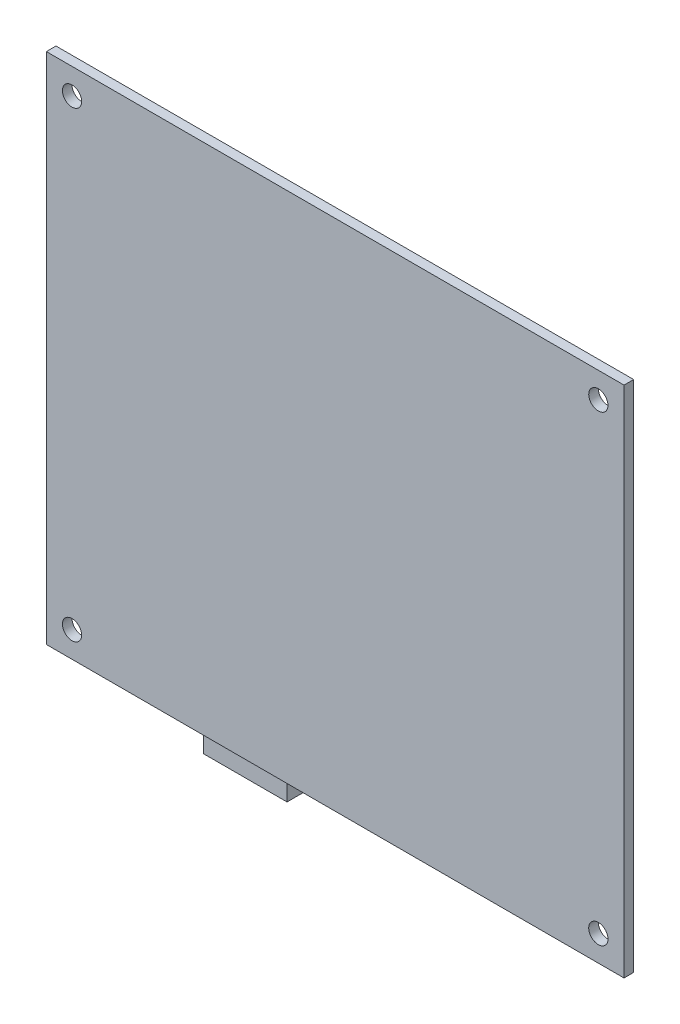
ISO-10303-21;
HEADER;
FILE_DESCRIPTION(('STEP AP214'),'2;1');
FILE_NAME('part.step','',(''),(''),'','','');
FILE_SCHEMA(('AUTOMOTIVE_DESIGN { 1 0 10303 214 1 1 1 1 }'));
ENDSEC;
DATA;
#1=APPLICATION_CONTEXT('core data for automotive mechanical design processes');
#2=APPLICATION_PROTOCOL_DEFINITION('international standard','automotive_design',2000,#1);
#3=PRODUCT_CONTEXT('',#1,'mechanical');
#4=PRODUCT('Part','Part','',(#3));
#5=PRODUCT_RELATED_PRODUCT_CATEGORY('part','',(#4));
#6=PRODUCT_DEFINITION_FORMATION('','',#4);
#7=PRODUCT_DEFINITION_CONTEXT('part definition',#1,'design');
#8=PRODUCT_DEFINITION('design','',#6,#7);
#9=PRODUCT_DEFINITION_SHAPE('','',#8);
#10=(LENGTH_UNIT() NAMED_UNIT(*) SI_UNIT(.MILLI.,.METRE.));
#11=(NAMED_UNIT(*) PLANE_ANGLE_UNIT() SI_UNIT($,.RADIAN.));
#12=(NAMED_UNIT(*) SI_UNIT($,.STERADIAN.) SOLID_ANGLE_UNIT());
#13=UNCERTAINTY_MEASURE_WITH_UNIT(LENGTH_MEASURE(1.E-05),#10,'distance_accuracy_value','');
#14=(GEOMETRIC_REPRESENTATION_CONTEXT(3) GLOBAL_UNCERTAINTY_ASSIGNED_CONTEXT((#13)) GLOBAL_UNIT_ASSIGNED_CONTEXT((#10,
#11,#12)) REPRESENTATION_CONTEXT('',''));
#15=CARTESIAN_POINT('',(0.,0.,0.));
#16=DIRECTION('',(0.,0.,1.));
#17=DIRECTION('',(1.,0.,0.));
#18=AXIS2_PLACEMENT_3D('',#15,#16,#17);
#19=CARTESIAN_POINT('',(0.,0.,0.));
#20=DIRECTION('',(0.,0.,-1.));
#21=DIRECTION('',(-1.,0.,0.));
#22=AXIS2_PLACEMENT_3D('',#19,#20,#21);
#23=PLANE('',#22);
#24=CARTESIAN_POINT('',(85.9999999999999,4.,0.));
#25=DIRECTION('',(0.,0.,1.));
#26=DIRECTION('',(1.,0.,0.));
#27=AXIS2_PLACEMENT_3D('',#24,#25,#26);
#28=CIRCLE('',#27,1.5);
#29=CARTESIAN_POINT('',(87.4999999999999,4.,0.));
#30=VERTEX_POINT('',#29);
#31=EDGE_CURVE('E345',#30,#30,#28,.T.);
#32=ORIENTED_EDGE('',*,*,#31,.T.);
#33=EDGE_LOOP('',(#32));
#34=FACE_BOUND('',#33,.T.);
#35=CARTESIAN_POINT('',(4.,76.,0.));
#36=DIRECTION('',(0.,0.,1.));
#37=DIRECTION('',(1.,0.,0.));
#38=AXIS2_PLACEMENT_3D('',#35,#36,#37);
#39=CIRCLE('',#38,1.5);
#40=CARTESIAN_POINT('',(5.5,76.,0.));
#41=VERTEX_POINT('',#40);
#42=EDGE_CURVE('E361',#41,#41,#39,.T.);
#43=ORIENTED_EDGE('',*,*,#42,.T.);
#44=EDGE_LOOP('',(#43));
#45=FACE_BOUND('',#44,.T.);
#46=CARTESIAN_POINT('',(86.,76.,0.));
#47=DIRECTION('',(0.,0.,1.));
#48=DIRECTION('',(-1.,0.,0.));
#49=AXIS2_PLACEMENT_3D('',#46,#47,#48);
#50=CIRCLE('',#49,1.5);
#51=CARTESIAN_POINT('',(84.5,76.,0.));
#52=VERTEX_POINT('',#51);
#53=EDGE_CURVE('E353',#52,#52,#50,.T.);
#54=ORIENTED_EDGE('',*,*,#53,.T.);
#55=EDGE_LOOP('',(#54));
#56=FACE_BOUND('',#55,.T.);
#57=CARTESIAN_POINT('',(4.,4.,0.));
#58=DIRECTION('',(0.,0.,1.));
#59=DIRECTION('',(-1.,0.,0.));
#60=AXIS2_PLACEMENT_3D('',#57,#58,#59);
#61=CIRCLE('',#60,1.5);
#62=CARTESIAN_POINT('',(2.5,4.,0.));
#63=VERTEX_POINT('',#62);
#64=EDGE_CURVE('E340',#63,#63,#61,.T.);
#65=ORIENTED_EDGE('',*,*,#64,.T.);
#66=EDGE_LOOP('',(#65));
#67=FACE_BOUND('',#66,.T.);
#68=DIRECTION('',(1.,0.,0.));
#69=VECTOR('',#68,1.);
#70=CARTESIAN_POINT('',(10.,15.,0.));
#71=LINE('',#70,#69);
#72=CARTESIAN_POINT('',(10.,15.,0.));
#73=VERTEX_POINT('',#72);
#74=CARTESIAN_POINT('',(20.,15.,0.));
#75=VERTEX_POINT('',#74);
#76=EDGE_CURVE('E284',#73,#75,#71,.T.);
#77=ORIENTED_EDGE('',*,*,#76,.F.);
#78=DIRECTION('',(0.,-1.,0.));
#79=VECTOR('',#78,1.);
#80=CARTESIAN_POINT('',(10.,15.,0.));
#81=LINE('',#80,#79);
#82=CARTESIAN_POINT('',(10.,0.,0.));
#83=VERTEX_POINT('',#82);
#84=EDGE_CURVE('E242',#73,#83,#81,.T.);
#85=ORIENTED_EDGE('',*,*,#84,.T.);
#86=DIRECTION('',(1.,0.,0.));
#87=VECTOR('',#86,1.);
#88=CARTESIAN_POINT('',(0.,0.,0.));
#89=LINE('',#88,#87);
#90=CARTESIAN_POINT('',(0.,0.,0.));
#91=VERTEX_POINT('',#90);
#92=EDGE_CURVE('E392',#91,#83,#89,.T.);
#93=ORIENTED_EDGE('',*,*,#92,.F.);
#94=DIRECTION('',(0.,-1.,0.));
#95=VECTOR('',#94,1.);
#96=CARTESIAN_POINT('',(0.,0.,0.));
#97=LINE('',#96,#95);
#98=CARTESIAN_POINT('',(0.,80.,0.));
#99=VERTEX_POINT('',#98);
#100=EDGE_CURVE('E369',#99,#91,#97,.T.);
#101=ORIENTED_EDGE('',*,*,#100,.F.);
#102=DIRECTION('',(-1.,0.,0.));
#103=VECTOR('',#102,1.);
#104=CARTESIAN_POINT('',(0.,80.,0.));
#105=LINE('',#104,#103);
#106=CARTESIAN_POINT('',(90.,80.,0.));
#107=VERTEX_POINT('',#106);
#108=EDGE_CURVE('E378',#107,#99,#105,.T.);
#109=ORIENTED_EDGE('',*,*,#108,.F.);
#110=DIRECTION('',(0.,1.,0.));
#111=VECTOR('',#110,1.);
#112=CARTESIAN_POINT('',(90.,0.,0.));
#113=LINE('',#112,#111);
#114=CARTESIAN_POINT('',(90.,0.,0.));
#115=VERTEX_POINT('',#114);
#116=EDGE_CURVE('E396',#115,#107,#113,.T.);
#117=ORIENTED_EDGE('',*,*,#116,.F.);
#118=CARTESIAN_POINT('',(36.,0.,0.));
#119=VERTEX_POINT('',#118);
#120=EDGE_CURVE('E391',#119,#115,#89,.T.);
#121=ORIENTED_EDGE('',*,*,#120,.F.);
#122=DIRECTION('',(0.,-1.,0.));
#123=VECTOR('',#122,1.);
#124=CARTESIAN_POINT('',(36.,15.,0.));
#125=LINE('',#124,#123);
#126=CARTESIAN_POINT('',(36.,15.,0.));
#127=VERTEX_POINT('',#126);
#128=EDGE_CURVE('E332',#127,#119,#125,.T.);
#129=ORIENTED_EDGE('',*,*,#128,.F.);
#130=DIRECTION('',(1.,0.,0.));
#131=VECTOR('',#130,1.);
#132=CARTESIAN_POINT('',(23.,15.,0.));
#133=LINE('',#132,#131);
#134=CARTESIAN_POINT('',(23.,15.,0.));
#135=VERTEX_POINT('',#134);
#136=EDGE_CURVE('E317',#135,#127,#133,.T.);
#137=ORIENTED_EDGE('',*,*,#136,.F.);
#138=DIRECTION('',(0.,-1.,0.));
#139=VECTOR('',#138,1.);
#140=CARTESIAN_POINT('',(23.,15.,0.));
#141=LINE('',#140,#139);
#142=CARTESIAN_POINT('',(23.,0.,0.));
#143=VERTEX_POINT('',#142);
#144=EDGE_CURVE('E336',#135,#143,#141,.T.);
#145=ORIENTED_EDGE('',*,*,#144,.T.);
#146=CARTESIAN_POINT('',(20.,0.,0.));
#147=VERTEX_POINT('',#146);
#148=EDGE_CURVE('E397',#147,#143,#89,.T.);
#149=ORIENTED_EDGE('',*,*,#148,.F.);
#150=DIRECTION('',(0.,-1.,0.));
#151=VECTOR('',#150,1.);
#152=CARTESIAN_POINT('',(20.,15.,0.));
#153=LINE('',#152,#151);
#154=EDGE_CURVE('E257',#75,#147,#153,.T.);
#155=ORIENTED_EDGE('',*,*,#154,.F.);
#156=EDGE_LOOP('',(#77,#85,#93,#101,#109,#117,#121,#129,#137,#145,#149,#155));
#157=FACE_BOUND('',#156,.T.);
#158=ADVANCED_FACE('F45',(#34,#45,#56,#67,#157),#23,.T.);
#159=CARTESIAN_POINT('',(0.,0.,1.5));
#160=DIRECTION('',(0.,1.,0.));
#161=DIRECTION('',(0.,0.,1.));
#162=AXIS2_PLACEMENT_3D('',#159,#160,#161);
#163=PLANE('',#162);
#164=DIRECTION('',(-1.,0.,0.));
#165=VECTOR('',#164,1.);
#166=CARTESIAN_POINT('',(23.,0.,0.));
#167=LINE('',#166,#165);
#168=EDGE_CURVE('E278',#119,#143,#167,.T.);
#169=ORIENTED_EDGE('',*,*,#168,.F.);
#170=ORIENTED_EDGE('',*,*,#120,.T.);
#171=DIRECTION('',(0.,0.,-1.));
#172=VECTOR('',#171,1.);
#173=CARTESIAN_POINT('',(90.,0.,1.5));
#174=LINE('',#173,#172);
#175=CARTESIAN_POINT('',(90.,0.,1.5));
#176=VERTEX_POINT('',#175);
#177=EDGE_CURVE('E54',#176,#115,#174,.T.);
#178=ORIENTED_EDGE('',*,*,#177,.F.);
#179=DIRECTION('',(1.,0.,0.));
#180=VECTOR('',#179,1.);
#181=CARTESIAN_POINT('',(0.,0.,1.5));
#182=LINE('',#181,#180);
#183=CARTESIAN_POINT('',(0.,0.,1.5));
#184=VERTEX_POINT('',#183);
#185=EDGE_CURVE('E377',#184,#176,#182,.T.);
#186=ORIENTED_EDGE('',*,*,#185,.F.);
#187=DIRECTION('',(0.,0.,-1.));
#188=VECTOR('',#187,1.);
#189=CARTESIAN_POINT('',(0.,0.,1.5));
#190=LINE('',#189,#188);
#191=EDGE_CURVE('E11',#184,#91,#190,.T.);
#192=ORIENTED_EDGE('',*,*,#191,.T.);
#193=ORIENTED_EDGE('',*,*,#92,.T.);
#194=DIRECTION('',(0.,0.,1.));
#195=VECTOR('',#194,1.);
#196=CARTESIAN_POINT('',(10.,0.,0.));
#197=LINE('',#196,#195);
#198=CARTESIAN_POINT('',(10.,0.,-12.));
#199=VERTEX_POINT('',#198);
#200=EDGE_CURVE('E275',#199,#83,#197,.T.);
#201=ORIENTED_EDGE('',*,*,#200,.F.);
#202=DIRECTION('',(-1.,0.,0.));
#203=VECTOR('',#202,1.);
#204=CARTESIAN_POINT('',(10.,0.,-12.));
#205=LINE('',#204,#203);
#206=CARTESIAN_POINT('',(20.,0.,-12.));
#207=VERTEX_POINT('',#206);
#208=EDGE_CURVE('E269',#207,#199,#205,.T.);
#209=ORIENTED_EDGE('',*,*,#208,.F.);
#210=DIRECTION('',(0.,0.,-1.));
#211=VECTOR('',#210,1.);
#212=CARTESIAN_POINT('',(20.,0.,0.));
#213=LINE('',#212,#211);
#214=EDGE_CURVE('E69',#147,#207,#213,.T.);
#215=ORIENTED_EDGE('',*,*,#214,.F.);
#216=ORIENTED_EDGE('',*,*,#148,.T.);
#217=EDGE_LOOP('',(#169,#170,#178,#186,#192,#193,#201,#209,#215,#216));
#218=FACE_BOUND('',#217,.T.);
#219=ADVANCED_FACE('F432',(#218),#163,.F.);
#220=CARTESIAN_POINT('',(0.,0.,1.5));
#221=DIRECTION('',(0.,0.,-1.));
#222=DIRECTION('',(-1.,0.,0.));
#223=AXIS2_PLACEMENT_3D('',#220,#221,#222);
#224=PLANE('',#223);
#225=DIRECTION('',(0.,-1.,0.));
#226=VECTOR('',#225,1.);
#227=CARTESIAN_POINT('',(0.,0.,1.5));
#228=LINE('',#227,#226);
#229=CARTESIAN_POINT('',(0.,80.,1.5));
#230=VERTEX_POINT('',#229);
#231=EDGE_CURVE('E373',#230,#184,#228,.T.);
#232=ORIENTED_EDGE('',*,*,#231,.T.);
#233=ORIENTED_EDGE('',*,*,#185,.T.);
#234=DIRECTION('',(0.,1.,0.));
#235=VECTOR('',#234,1.);
#236=CARTESIAN_POINT('',(90.,0.,1.5));
#237=LINE('',#236,#235);
#238=CARTESIAN_POINT('',(90.,80.,1.5));
#239=VERTEX_POINT('',#238);
#240=EDGE_CURVE('E381',#176,#239,#237,.T.);
#241=ORIENTED_EDGE('',*,*,#240,.T.);
#242=DIRECTION('',(-1.,0.,0.));
#243=VECTOR('',#242,1.);
#244=CARTESIAN_POINT('',(0.,80.,1.5));
#245=LINE('',#244,#243);
#246=EDGE_CURVE('E384',#239,#230,#245,.T.);
#247=ORIENTED_EDGE('',*,*,#246,.T.);
#248=EDGE_LOOP('',(#232,#233,#241,#247));
#249=FACE_BOUND('',#248,.T.);
#250=CARTESIAN_POINT('',(4.,76.,1.5));
#251=DIRECTION('',(0.,0.,1.));
#252=DIRECTION('',(1.,0.,0.));
#253=AXIS2_PLACEMENT_3D('',#250,#251,#252);
#254=CIRCLE('',#253,1.5);
#255=CARTESIAN_POINT('',(5.5,76.,1.5));
#256=VERTEX_POINT('',#255);
#257=EDGE_CURVE('E365',#256,#256,#254,.T.);
#258=ORIENTED_EDGE('',*,*,#257,.F.);
#259=EDGE_LOOP('',(#258));
#260=FACE_BOUND('',#259,.T.);
#261=CARTESIAN_POINT('',(86.,76.,1.5));
#262=DIRECTION('',(0.,0.,1.));
#263=DIRECTION('',(-1.,0.,0.));
#264=AXIS2_PLACEMENT_3D('',#261,#262,#263);
#265=CIRCLE('',#264,1.5);
#266=CARTESIAN_POINT('',(84.5,76.,1.5));
#267=VERTEX_POINT('',#266);
#268=EDGE_CURVE('E357',#267,#267,#265,.T.);
#269=ORIENTED_EDGE('',*,*,#268,.F.);
#270=EDGE_LOOP('',(#269));
#271=FACE_BOUND('',#270,.T.);
#272=CARTESIAN_POINT('',(85.9999999999999,4.,1.5));
#273=DIRECTION('',(0.,0.,1.));
#274=DIRECTION('',(1.,0.,0.));
#275=AXIS2_PLACEMENT_3D('',#272,#273,#274);
#276=CIRCLE('',#275,1.5);
#277=CARTESIAN_POINT('',(87.4999999999999,4.,1.5));
#278=VERTEX_POINT('',#277);
#279=EDGE_CURVE('E349',#278,#278,#276,.T.);
#280=ORIENTED_EDGE('',*,*,#279,.F.);
#281=EDGE_LOOP('',(#280));
#282=FACE_BOUND('',#281,.T.);
#283=CARTESIAN_POINT('',(4.,4.,1.5));
#284=DIRECTION('',(0.,0.,1.));
#285=DIRECTION('',(-1.,0.,0.));
#286=AXIS2_PLACEMENT_3D('',#283,#284,#285);
#287=CIRCLE('',#286,1.5);
#288=CARTESIAN_POINT('',(2.5,4.,1.5));
#289=VERTEX_POINT('',#288);
#290=EDGE_CURVE('E341',#289,#289,#287,.T.);
#291=ORIENTED_EDGE('',*,*,#290,.F.);
#292=EDGE_LOOP('',(#291));
#293=FACE_BOUND('',#292,.T.);
#294=ADVANCED_FACE('F430',(#249,#260,#271,#282,#293),#224,.F.);
#295=CARTESIAN_POINT('',(0.,0.,1.5));
#296=DIRECTION('',(1.,0.,0.));
#297=DIRECTION('',(0.,0.,-1.));
#298=AXIS2_PLACEMENT_3D('',#295,#296,#297);
#299=PLANE('',#298);
#300=ORIENTED_EDGE('',*,*,#100,.T.);
#301=ORIENTED_EDGE('',*,*,#191,.F.);
#302=ORIENTED_EDGE('',*,*,#231,.F.);
#303=DIRECTION('',(0.,0.,-1.));
#304=VECTOR('',#303,1.);
#305=CARTESIAN_POINT('',(0.,80.,1.5));
#306=LINE('',#305,#304);
#307=EDGE_CURVE('E387',#230,#99,#306,.T.);
#308=ORIENTED_EDGE('',*,*,#307,.T.);
#309=EDGE_LOOP('',(#300,#301,#302,#308));
#310=FACE_BOUND('',#309,.T.);
#311=ADVANCED_FACE('F47',(#310),#299,.F.);
#312=CARTESIAN_POINT('',(90.,0.,1.5));
#313=DIRECTION('',(-1.,0.,0.));
#314=DIRECTION('',(0.,0.,1.));
#315=AXIS2_PLACEMENT_3D('',#312,#313,#314);
#316=PLANE('',#315);
#317=ORIENTED_EDGE('',*,*,#116,.T.);
#318=DIRECTION('',(0.,0.,-1.));
#319=VECTOR('',#318,1.);
#320=CARTESIAN_POINT('',(90.,80.,1.5));
#321=LINE('',#320,#319);
#322=EDGE_CURVE('E405',#239,#107,#321,.T.);
#323=ORIENTED_EDGE('',*,*,#322,.F.);
#324=ORIENTED_EDGE('',*,*,#240,.F.);
#325=ORIENTED_EDGE('',*,*,#177,.T.);
#326=EDGE_LOOP('',(#317,#323,#324,#325));
#327=FACE_BOUND('',#326,.T.);
#328=ADVANCED_FACE('F414',(#327),#316,.F.);
#329=CARTESIAN_POINT('',(0.,80.,1.5));
#330=DIRECTION('',(0.,-1.,0.));
#331=DIRECTION('',(0.,0.,-1.));
#332=AXIS2_PLACEMENT_3D('',#329,#330,#331);
#333=PLANE('',#332);
#334=ORIENTED_EDGE('',*,*,#108,.T.);
#335=ORIENTED_EDGE('',*,*,#307,.F.);
#336=ORIENTED_EDGE('',*,*,#246,.F.);
#337=ORIENTED_EDGE('',*,*,#322,.T.);
#338=EDGE_LOOP('',(#334,#335,#336,#337));
#339=FACE_BOUND('',#338,.T.);
#340=ADVANCED_FACE('F424',(#339),#333,.F.);
#341=CARTESIAN_POINT('',(4.,76.,1.5));
#342=DIRECTION('',(0.,0.,-1.));
#343=DIRECTION('',(-1.,0.,0.));
#344=AXIS2_PLACEMENT_3D('',#341,#342,#343);
#345=CYLINDRICAL_SURFACE('',#344,1.5);
#346=ORIENTED_EDGE('',*,*,#257,.T.);
#347=EDGE_LOOP('',(#346));
#348=FACE_BOUND('',#347,.T.);
#349=ORIENTED_EDGE('',*,*,#42,.F.);
#350=EDGE_LOOP('',(#349));
#351=FACE_BOUND('',#350,.T.);
#352=ADVANCED_FACE('F496',(#348,#351),#345,.F.);
#353=CARTESIAN_POINT('',(86.,76.,1.5));
#354=DIRECTION('',(0.,0.,-1.));
#355=DIRECTION('',(-1.,0.,0.));
#356=AXIS2_PLACEMENT_3D('',#353,#354,#355);
#357=CYLINDRICAL_SURFACE('',#356,1.5);
#358=ORIENTED_EDGE('',*,*,#268,.T.);
#359=EDGE_LOOP('',(#358));
#360=FACE_BOUND('',#359,.T.);
#361=ORIENTED_EDGE('',*,*,#53,.F.);
#362=EDGE_LOOP('',(#361));
#363=FACE_BOUND('',#362,.T.);
#364=ADVANCED_FACE('F530',(#360,#363),#357,.F.);
#365=CARTESIAN_POINT('',(85.9999999999999,4.,1.5));
#366=DIRECTION('',(0.,0.,-1.));
#367=DIRECTION('',(-1.,0.,0.));
#368=AXIS2_PLACEMENT_3D('',#365,#366,#367);
#369=CYLINDRICAL_SURFACE('',#368,1.5);
#370=ORIENTED_EDGE('',*,*,#279,.T.);
#371=EDGE_LOOP('',(#370));
#372=FACE_BOUND('',#371,.T.);
#373=ORIENTED_EDGE('',*,*,#31,.F.);
#374=EDGE_LOOP('',(#373));
#375=FACE_BOUND('',#374,.T.);
#376=ADVANCED_FACE('F539',(#372,#375),#369,.F.);
#377=CARTESIAN_POINT('',(4.,4.,1.5));
#378=DIRECTION('',(0.,0.,-1.));
#379=DIRECTION('',(-1.,0.,0.));
#380=AXIS2_PLACEMENT_3D('',#377,#378,#379);
#381=CYLINDRICAL_SURFACE('',#380,1.5);
#382=ORIENTED_EDGE('',*,*,#290,.T.);
#383=EDGE_LOOP('',(#382));
#384=FACE_BOUND('',#383,.T.);
#385=ORIENTED_EDGE('',*,*,#64,.F.);
#386=EDGE_LOOP('',(#385));
#387=FACE_BOUND('',#386,.T.);
#388=ADVANCED_FACE('F549',(#384,#387),#381,.F.);
#389=CARTESIAN_POINT('',(23.,15.,-8.));
#390=DIRECTION('',(1.,0.,0.));
#391=DIRECTION('',(0.,0.,-1.));
#392=AXIS2_PLACEMENT_3D('',#389,#390,#391);
#393=PLANE('',#392);
#394=DIRECTION('',(0.,-1.,0.));
#395=VECTOR('',#394,1.);
#396=CARTESIAN_POINT('',(23.,15.,-8.));
#397=LINE('',#396,#395);
#398=CARTESIAN_POINT('',(23.,15.,-8.));
#399=VERTEX_POINT('',#398);
#400=CARTESIAN_POINT('',(23.,-4.,-8.));
#401=VERTEX_POINT('',#400);
#402=EDGE_CURVE('E326',#399,#401,#397,.T.);
#403=ORIENTED_EDGE('',*,*,#402,.T.);
#404=DIRECTION('',(0.,0.,-1.));
#405=VECTOR('',#404,1.);
#406=CARTESIAN_POINT('',(23.,-4.,0.));
#407=LINE('',#406,#405);
#408=CARTESIAN_POINT('',(23.,-4.,0.));
#409=VERTEX_POINT('',#408);
#410=EDGE_CURVE('E289',#409,#401,#407,.T.);
#411=ORIENTED_EDGE('',*,*,#410,.F.);
#412=DIRECTION('',(0.,1.,0.));
#413=VECTOR('',#412,1.);
#414=CARTESIAN_POINT('',(23.,-4.,0.));
#415=LINE('',#414,#413);
#416=EDGE_CURVE('E303',#409,#143,#415,.T.);
#417=ORIENTED_EDGE('',*,*,#416,.T.);
#418=ORIENTED_EDGE('',*,*,#144,.F.);
#419=DIRECTION('',(0.,0.,1.));
#420=VECTOR('',#419,1.);
#421=CARTESIAN_POINT('',(23.,15.,-8.));
#422=LINE('',#421,#420);
#423=EDGE_CURVE('E314',#399,#135,#422,.T.);
#424=ORIENTED_EDGE('',*,*,#423,.F.);
#425=EDGE_LOOP('',(#403,#411,#417,#418,#424));
#426=FACE_BOUND('',#425,.T.);
#427=ADVANCED_FACE('F467',(#426),#393,.F.);
#428=CARTESIAN_POINT('',(36.,15.,-8.));
#429=DIRECTION('',(-1.,0.,0.));
#430=DIRECTION('',(0.,0.,1.));
#431=AXIS2_PLACEMENT_3D('',#428,#429,#430);
#432=PLANE('',#431);
#433=ORIENTED_EDGE('',*,*,#128,.T.);
#434=DIRECTION('',(0.,1.,0.));
#435=VECTOR('',#434,1.);
#436=CARTESIAN_POINT('',(36.,-4.,0.));
#437=LINE('',#436,#435);
#438=CARTESIAN_POINT('',(36.,-4.,0.));
#439=VERTEX_POINT('',#438);
#440=EDGE_CURVE('E310',#439,#119,#437,.T.);
#441=ORIENTED_EDGE('',*,*,#440,.F.);
#442=DIRECTION('',(0.,0.,1.));
#443=VECTOR('',#442,1.);
#444=CARTESIAN_POINT('',(36.,-4.,0.));
#445=LINE('',#444,#443);
#446=CARTESIAN_POINT('',(36.,-4.,-8.));
#447=VERTEX_POINT('',#446);
#448=EDGE_CURVE('E297',#447,#439,#445,.T.);
#449=ORIENTED_EDGE('',*,*,#448,.F.);
#450=DIRECTION('',(0.,-1.,0.));
#451=VECTOR('',#450,1.);
#452=CARTESIAN_POINT('',(36.,15.,-8.));
#453=LINE('',#452,#451);
#454=CARTESIAN_POINT('',(36.,15.,-8.));
#455=VERTEX_POINT('',#454);
#456=EDGE_CURVE('E329',#455,#447,#453,.T.);
#457=ORIENTED_EDGE('',*,*,#456,.F.);
#458=DIRECTION('',(0.,0.,-1.));
#459=VECTOR('',#458,1.);
#460=CARTESIAN_POINT('',(36.,15.,-8.));
#461=LINE('',#460,#459);
#462=EDGE_CURVE('E320',#127,#455,#461,.T.);
#463=ORIENTED_EDGE('',*,*,#462,.F.);
#464=EDGE_LOOP('',(#433,#441,#449,#457,#463));
#465=FACE_BOUND('',#464,.T.);
#466=ADVANCED_FACE('F457',(#465),#432,.F.);
#467=CARTESIAN_POINT('',(23.,15.,-8.));
#468=DIRECTION('',(0.,0.,1.));
#469=DIRECTION('',(1.,0.,0.));
#470=AXIS2_PLACEMENT_3D('',#467,#468,#469);
#471=PLANE('',#470);
#472=ORIENTED_EDGE('',*,*,#456,.T.);
#473=DIRECTION('',(1.,0.,0.));
#474=VECTOR('',#473,1.);
#475=CARTESIAN_POINT('',(23.,-4.,-8.));
#476=LINE('',#475,#474);
#477=EDGE_CURVE('E293',#401,#447,#476,.T.);
#478=ORIENTED_EDGE('',*,*,#477,.F.);
#479=ORIENTED_EDGE('',*,*,#402,.F.);
#480=DIRECTION('',(-1.,0.,0.));
#481=VECTOR('',#480,1.);
#482=CARTESIAN_POINT('',(23.,15.,-8.));
#483=LINE('',#482,#481);
#484=EDGE_CURVE('E323',#455,#399,#483,.T.);
#485=ORIENTED_EDGE('',*,*,#484,.F.);
#486=EDGE_LOOP('',(#472,#478,#479,#485));
#487=FACE_BOUND('',#486,.T.);
#488=ADVANCED_FACE('F474',(#487),#471,.F.);
#489=CARTESIAN_POINT('',(0.,15.,0.));
#490=DIRECTION('',(0.,1.,0.));
#491=DIRECTION('',(0.,0.,1.));
#492=AXIS2_PLACEMENT_3D('',#489,#490,#491);
#493=PLANE('',#492);
#494=ORIENTED_EDGE('',*,*,#423,.T.);
#495=ORIENTED_EDGE('',*,*,#136,.T.);
#496=ORIENTED_EDGE('',*,*,#462,.T.);
#497=ORIENTED_EDGE('',*,*,#484,.T.);
#498=EDGE_LOOP('',(#494,#495,#496,#497));
#499=FACE_BOUND('',#498,.T.);
#500=ADVANCED_FACE('F462',(#499),#493,.T.);
#501=CARTESIAN_POINT('',(23.,-4.,0.));
#502=DIRECTION('',(0.,0.,-1.));
#503=DIRECTION('',(-1.,0.,0.));
#504=AXIS2_PLACEMENT_3D('',#501,#502,#503);
#505=PLANE('',#504);
#506=ORIENTED_EDGE('',*,*,#168,.T.);
#507=ORIENTED_EDGE('',*,*,#416,.F.);
#508=DIRECTION('',(-1.,0.,0.));
#509=VECTOR('',#508,1.);
#510=CARTESIAN_POINT('',(23.,-4.,0.));
#511=LINE('',#510,#509);
#512=EDGE_CURVE('E300',#439,#409,#511,.T.);
#513=ORIENTED_EDGE('',*,*,#512,.F.);
#514=ORIENTED_EDGE('',*,*,#440,.T.);
#515=EDGE_LOOP('',(#506,#507,#513,#514));
#516=FACE_BOUND('',#515,.T.);
#517=ADVANCED_FACE('F469',(#516),#505,.F.);
#518=CARTESIAN_POINT('',(0.,-4.,0.));
#519=DIRECTION('',(0.,-1.,0.));
#520=DIRECTION('',(0.,0.,-1.));
#521=AXIS2_PLACEMENT_3D('',#518,#519,#520);
#522=PLANE('',#521);
#523=DIRECTION('',(0.,0.,1.));
#524=VECTOR('',#523,1.);
#525=CARTESIAN_POINT('',(35.1163448834018,-4.,-6.7360954093425));
#526=LINE('',#525,#524);
#527=CARTESIAN_POINT('',(35.1163448834018,-4.,-6.7360954093425));
#528=VERTEX_POINT('',#527);
#529=CARTESIAN_POINT('',(35.1163448834018,-4.,-1.21963673961324));
#530=VERTEX_POINT('',#529);
#531=EDGE_CURVE('E61',#528,#530,#526,.T.);
#532=ORIENTED_EDGE('',*,*,#531,.F.);
#533=DIRECTION('',(1.,0.,0.));
#534=VECTOR('',#533,1.);
#535=CARTESIAN_POINT('',(25.0028373222315,-4.,-6.7360954093425));
#536=LINE('',#535,#534);
#537=CARTESIAN_POINT('',(25.0028373222315,-4.,-6.7360954093425));
#538=VERTEX_POINT('',#537);
#539=EDGE_CURVE('E201',#538,#528,#536,.T.);
#540=ORIENTED_EDGE('',*,*,#539,.F.);
#541=DIRECTION('',(0.707106781186553,0.,-0.707106781186542));
#542=VECTOR('',#541,1.);
#543=CARTESIAN_POINT('',(23.8535750993712,-4.,-5.58683318648224));
#544=LINE('',#543,#542);
#545=CARTESIAN_POINT('',(23.8535750993712,-4.,-5.58683318648224));
#546=VERTEX_POINT('',#545);
#547=EDGE_CURVE('E205',#546,#538,#544,.T.);
#548=ORIENTED_EDGE('',*,*,#547,.F.);
#549=DIRECTION('',(0.,0.,-1.));
#550=VECTOR('',#549,1.);
#551=CARTESIAN_POINT('',(23.8535750993712,-4.,-2.52213392552155));
#552=LINE('',#551,#550);
#553=CARTESIAN_POINT('',(23.8535750993712,-4.,-2.52213392552155));
#554=VERTEX_POINT('',#553);
#555=EDGE_CURVE('E232',#554,#546,#552,.T.);
#556=ORIENTED_EDGE('',*,*,#555,.F.);
#557=DIRECTION('',(-0.707106781186542,0.,-0.707106781186553));
#558=VECTOR('',#557,1.);
#559=CARTESIAN_POINT('',(25.1560722852795,-4.,-1.21963673961324));
#560=LINE('',#559,#558);
#561=CARTESIAN_POINT('',(25.1560722852795,-4.,-1.21963673961324));
#562=VERTEX_POINT('',#561);
#563=EDGE_CURVE('E228',#562,#554,#560,.T.);
#564=ORIENTED_EDGE('',*,*,#563,.F.);
#565=DIRECTION('',(-1.,0.,0.));
#566=VECTOR('',#565,1.);
#567=CARTESIAN_POINT('',(35.1163448834018,-4.,-1.21963673961324));
#568=LINE('',#567,#566);
#569=EDGE_CURVE('E224',#530,#562,#568,.T.);
#570=ORIENTED_EDGE('',*,*,#569,.F.);
#571=EDGE_LOOP('',(#532,#540,#548,#556,#564,#570));
#572=FACE_BOUND('',#571,.T.);
#573=ORIENTED_EDGE('',*,*,#410,.T.);
#574=ORIENTED_EDGE('',*,*,#477,.T.);
#575=ORIENTED_EDGE('',*,*,#448,.T.);
#576=ORIENTED_EDGE('',*,*,#512,.T.);
#577=EDGE_LOOP('',(#573,#574,#575,#576));
#578=FACE_BOUND('',#577,.T.);
#579=ADVANCED_FACE('F471',(#572,#578),#522,.T.);
#580=CARTESIAN_POINT('',(10.,15.,0.));
#581=DIRECTION('',(1.,0.,0.));
#582=DIRECTION('',(0.,0.,-1.));
#583=AXIS2_PLACEMENT_3D('',#580,#581,#582);
#584=PLANE('',#583);
#585=ORIENTED_EDGE('',*,*,#200,.T.);
#586=ORIENTED_EDGE('',*,*,#84,.F.);
#587=DIRECTION('',(0.,0.,1.));
#588=VECTOR('',#587,1.);
#589=CARTESIAN_POINT('',(10.,15.,0.));
#590=LINE('',#589,#588);
#591=CARTESIAN_POINT('',(10.,15.,-12.));
#592=VERTEX_POINT('',#591);
#593=EDGE_CURVE('E272',#592,#73,#590,.T.);
#594=ORIENTED_EDGE('',*,*,#593,.F.);
#595=DIRECTION('',(0.,-1.,0.));
#596=VECTOR('',#595,1.);
#597=CARTESIAN_POINT('',(10.,15.,-12.));
#598=LINE('',#597,#596);
#599=EDGE_CURVE('E264',#592,#199,#598,.T.);
#600=ORIENTED_EDGE('',*,*,#599,.T.);
#601=EDGE_LOOP('',(#585,#586,#594,#600));
#602=FACE_BOUND('',#601,.T.);
#603=ADVANCED_FACE('F438',(#602),#584,.F.);
#604=CARTESIAN_POINT('',(20.,15.,0.));
#605=DIRECTION('',(-1.,0.,0.));
#606=DIRECTION('',(0.,0.,1.));
#607=AXIS2_PLACEMENT_3D('',#604,#605,#606);
#608=PLANE('',#607);
#609=ORIENTED_EDGE('',*,*,#214,.T.);
#610=DIRECTION('',(0.,-1.,0.));
#611=VECTOR('',#610,1.);
#612=CARTESIAN_POINT('',(20.,15.,-12.));
#613=LINE('',#612,#611);
#614=CARTESIAN_POINT('',(20.,15.,-12.));
#615=VERTEX_POINT('',#614);
#616=EDGE_CURVE('E260',#615,#207,#613,.T.);
#617=ORIENTED_EDGE('',*,*,#616,.F.);
#618=DIRECTION('',(0.,0.,-1.));
#619=VECTOR('',#618,1.);
#620=CARTESIAN_POINT('',(20.,15.,0.));
#621=LINE('',#620,#619);
#622=EDGE_CURVE('E281',#75,#615,#621,.T.);
#623=ORIENTED_EDGE('',*,*,#622,.F.);
#624=ORIENTED_EDGE('',*,*,#154,.T.);
#625=EDGE_LOOP('',(#609,#617,#623,#624));
#626=FACE_BOUND('',#625,.T.);
#627=ADVANCED_FACE('F446',(#626),#608,.F.);
#628=CARTESIAN_POINT('',(10.,15.,-12.));
#629=DIRECTION('',(0.,0.,1.));
#630=DIRECTION('',(1.,0.,0.));
#631=AXIS2_PLACEMENT_3D('',#628,#629,#630);
#632=PLANE('',#631);
#633=ORIENTED_EDGE('',*,*,#208,.T.);
#634=ORIENTED_EDGE('',*,*,#599,.F.);
#635=DIRECTION('',(-1.,0.,0.));
#636=VECTOR('',#635,1.);
#637=CARTESIAN_POINT('',(10.,15.,-12.));
#638=LINE('',#637,#636);
#639=EDGE_CURVE('E268',#615,#592,#638,.T.);
#640=ORIENTED_EDGE('',*,*,#639,.F.);
#641=ORIENTED_EDGE('',*,*,#616,.T.);
#642=EDGE_LOOP('',(#633,#634,#640,#641));
#643=FACE_BOUND('',#642,.T.);
#644=ADVANCED_FACE('F442',(#643),#632,.F.);
#645=CARTESIAN_POINT('',(0.,15.,0.));
#646=DIRECTION('',(0.,-1.,0.));
#647=DIRECTION('',(0.,0.,-1.));
#648=AXIS2_PLACEMENT_3D('',#645,#646,#647);
#649=PLANE('',#648);
#650=ORIENTED_EDGE('',*,*,#593,.T.);
#651=ORIENTED_EDGE('',*,*,#76,.T.);
#652=ORIENTED_EDGE('',*,*,#622,.T.);
#653=ORIENTED_EDGE('',*,*,#639,.T.);
#654=EDGE_LOOP('',(#650,#651,#652,#653));
#655=FACE_BOUND('',#654,.T.);
#656=ADVANCED_FACE('F645',(#655),#649,.F.);
#657=CARTESIAN_POINT('',(35.1163448834018,0.,-6.7360954093425));
#658=DIRECTION('',(1.,0.,0.));
#659=DIRECTION('',(0.,0.,-1.));
#660=AXIS2_PLACEMENT_3D('',#657,#658,#659);
#661=PLANE('',#660);
#662=ORIENTED_EDGE('',*,*,#531,.T.);
#663=DIRECTION('',(0.,-1.,0.));
#664=VECTOR('',#663,1.);
#665=CARTESIAN_POINT('',(35.1163448834018,0.,-1.21963673961324));
#666=LINE('',#665,#664);
#667=CARTESIAN_POINT('',(35.1163448834018,0.,-1.21963673961324));
#668=VERTEX_POINT('',#667);
#669=EDGE_CURVE('E175',#668,#530,#666,.T.);
#670=ORIENTED_EDGE('',*,*,#669,.F.);
#671=DIRECTION('',(0.,0.,1.));
#672=VECTOR('',#671,1.);
#673=CARTESIAN_POINT('',(35.1163448834018,0.,-6.7360954093425));
#674=LINE('',#673,#672);
#675=CARTESIAN_POINT('',(35.1163448834018,0.,-6.7360954093425));
#676=VERTEX_POINT('',#675);
#677=EDGE_CURVE('E179',#676,#668,#674,.T.);
#678=ORIENTED_EDGE('',*,*,#677,.F.);
#679=DIRECTION('',(0.,-1.,0.));
#680=VECTOR('',#679,1.);
#681=CARTESIAN_POINT('',(35.1163448834018,0.,-6.7360954093425));
#682=LINE('',#681,#680);
#683=EDGE_CURVE('E239',#676,#528,#682,.T.);
#684=ORIENTED_EDGE('',*,*,#683,.T.);
#685=EDGE_LOOP('',(#662,#670,#678,#684));
#686=FACE_BOUND('',#685,.T.);
#687=ADVANCED_FACE('F177',(#686),#661,.F.);
#688=CARTESIAN_POINT('',(25.0028373222315,0.,-6.7360954093425));
#689=DIRECTION('',(0.,0.,-1.));
#690=DIRECTION('',(-1.,0.,0.));
#691=AXIS2_PLACEMENT_3D('',#688,#689,#690);
#692=PLANE('',#691);
#693=ORIENTED_EDGE('',*,*,#539,.T.);
#694=ORIENTED_EDGE('',*,*,#683,.F.);
#695=DIRECTION('',(1.,0.,0.));
#696=VECTOR('',#695,1.);
#697=CARTESIAN_POINT('',(25.0028373222315,0.,-6.7360954093425));
#698=LINE('',#697,#696);
#699=CARTESIAN_POINT('',(25.0028373222315,0.,-6.7360954093425));
#700=VERTEX_POINT('',#699);
#701=EDGE_CURVE('E186',#700,#676,#698,.T.);
#702=ORIENTED_EDGE('',*,*,#701,.F.);
#703=DIRECTION('',(0.,-1.,0.));
#704=VECTOR('',#703,1.);
#705=CARTESIAN_POINT('',(25.0028373222315,0.,-6.7360954093425));
#706=LINE('',#705,#704);
#707=EDGE_CURVE('E243',#700,#538,#706,.T.);
#708=ORIENTED_EDGE('',*,*,#707,.T.);
#709=EDGE_LOOP('',(#693,#694,#702,#708));
#710=FACE_BOUND('',#709,.T.);
#711=ADVANCED_FACE('F676',(#710),#692,.F.);
#712=CARTESIAN_POINT('',(23.8535750993712,0.,-5.58683318648224));
#713=DIRECTION('',(-0.707106781186542,0.,-0.707106781186553));
#714=DIRECTION('',(-0.707106781186553,0.,0.707106781186542));
#715=AXIS2_PLACEMENT_3D('',#712,#713,#714);
#716=PLANE('',#715);
#717=ORIENTED_EDGE('',*,*,#547,.T.);
#718=ORIENTED_EDGE('',*,*,#707,.F.);
#719=DIRECTION('',(0.707106781186553,0.,-0.707106781186542));
#720=VECTOR('',#719,1.);
#721=CARTESIAN_POINT('',(23.8535750993712,0.,-5.58683318648224));
#722=LINE('',#721,#720);
#723=CARTESIAN_POINT('',(23.8535750993712,0.,-5.58683318648224));
#724=VERTEX_POINT('',#723);
#725=EDGE_CURVE('E217',#724,#700,#722,.T.);
#726=ORIENTED_EDGE('',*,*,#725,.F.);
#727=DIRECTION('',(0.,-1.,0.));
#728=VECTOR('',#727,1.);
#729=CARTESIAN_POINT('',(23.8535750993712,0.,-5.58683318648224));
#730=LINE('',#729,#728);
#731=EDGE_CURVE('E246',#724,#546,#730,.T.);
#732=ORIENTED_EDGE('',*,*,#731,.T.);
#733=EDGE_LOOP('',(#717,#718,#726,#732));
#734=FACE_BOUND('',#733,.T.);
#735=ADVANCED_FACE('F684',(#734),#716,.F.);
#736=CARTESIAN_POINT('',(23.8535750993712,0.,-2.52213392552155));
#737=DIRECTION('',(-1.,0.,0.));
#738=DIRECTION('',(0.,0.,1.));
#739=AXIS2_PLACEMENT_3D('',#736,#737,#738);
#740=PLANE('',#739);
#741=ORIENTED_EDGE('',*,*,#555,.T.);
#742=ORIENTED_EDGE('',*,*,#731,.F.);
#743=DIRECTION('',(0.,0.,-1.));
#744=VECTOR('',#743,1.);
#745=CARTESIAN_POINT('',(23.8535750993712,0.,-2.52213392552155));
#746=LINE('',#745,#744);
#747=CARTESIAN_POINT('',(23.8535750993712,0.,-2.52213392552155));
#748=VERTEX_POINT('',#747);
#749=EDGE_CURVE('E213',#748,#724,#746,.T.);
#750=ORIENTED_EDGE('',*,*,#749,.F.);
#751=DIRECTION('',(0.,-1.,0.));
#752=VECTOR('',#751,1.);
#753=CARTESIAN_POINT('',(23.8535750993712,0.,-2.52213392552155));
#754=LINE('',#753,#752);
#755=EDGE_CURVE('E249',#748,#554,#754,.T.);
#756=ORIENTED_EDGE('',*,*,#755,.T.);
#757=EDGE_LOOP('',(#741,#742,#750,#756));
#758=FACE_BOUND('',#757,.T.);
#759=ADVANCED_FACE('F693',(#758),#740,.F.);
#760=CARTESIAN_POINT('',(25.1560722852795,0.,-1.21963673961324));
#761=DIRECTION('',(-0.707106781186553,0.,0.707106781186542));
#762=DIRECTION('',(0.707106781186542,0.,0.707106781186553));
#763=AXIS2_PLACEMENT_3D('',#760,#761,#762);
#764=PLANE('',#763);
#765=ORIENTED_EDGE('',*,*,#563,.T.);
#766=ORIENTED_EDGE('',*,*,#755,.F.);
#767=DIRECTION('',(-0.707106781186542,0.,-0.707106781186553));
#768=VECTOR('',#767,1.);
#769=CARTESIAN_POINT('',(25.1560722852795,0.,-1.21963673961324));
#770=LINE('',#769,#768);
#771=CARTESIAN_POINT('',(25.1560722852795,0.,-1.21963673961324));
#772=VERTEX_POINT('',#771);
#773=EDGE_CURVE('E195',#772,#748,#770,.T.);
#774=ORIENTED_EDGE('',*,*,#773,.F.);
#775=DIRECTION('',(0.,-1.,0.));
#776=VECTOR('',#775,1.);
#777=CARTESIAN_POINT('',(25.1560722852795,0.,-1.21963673961324));
#778=LINE('',#777,#776);
#779=EDGE_CURVE('E185',#772,#562,#778,.T.);
#780=ORIENTED_EDGE('',*,*,#779,.T.);
#781=EDGE_LOOP('',(#765,#766,#774,#780));
#782=FACE_BOUND('',#781,.T.);
#783=ADVANCED_FACE('F702',(#782),#764,.F.);
#784=CARTESIAN_POINT('',(35.1163448834018,0.,-1.21963673961324));
#785=DIRECTION('',(0.,0.,1.));
#786=DIRECTION('',(1.,0.,0.));
#787=AXIS2_PLACEMENT_3D('',#784,#785,#786);
#788=PLANE('',#787);
#789=ORIENTED_EDGE('',*,*,#569,.T.);
#790=ORIENTED_EDGE('',*,*,#779,.F.);
#791=DIRECTION('',(-1.,0.,0.));
#792=VECTOR('',#791,1.);
#793=CARTESIAN_POINT('',(35.1163448834018,0.,-1.21963673961324));
#794=LINE('',#793,#792);
#795=EDGE_CURVE('E189',#668,#772,#794,.T.);
#796=ORIENTED_EDGE('',*,*,#795,.F.);
#797=ORIENTED_EDGE('',*,*,#669,.T.);
#798=EDGE_LOOP('',(#789,#790,#796,#797));
#799=FACE_BOUND('',#798,.T.);
#800=ADVANCED_FACE('F190',(#799),#788,.F.);
#801=CARTESIAN_POINT('',(0.,0.,0.));
#802=DIRECTION('',(0.,-1.,0.));
#803=DIRECTION('',(0.,0.,-1.));
#804=AXIS2_PLACEMENT_3D('',#801,#802,#803);
#805=PLANE('',#804);
#806=CARTESIAN_POINT('',(32.4347330300611,0.,-3.97786607447787));
#807=DIRECTION('',(0.,-1.,0.));
#808=DIRECTION('',(0.,0.,-1.));
#809=AXIS2_PLACEMENT_3D('',#806,#807,#808);
#810=CIRCLE('',#809,1.72176375554749);
#811=CARTESIAN_POINT('',(32.4347330300611,0.,-5.69962983002536));
#812=VERTEX_POINT('',#811);
#813=EDGE_CURVE('E767',#812,#812,#810,.T.);
#814=ORIENTED_EDGE('',*,*,#813,.F.);
#815=EDGE_LOOP('',(#814));
#816=FACE_BOUND('',#815,.T.);
#817=CARTESIAN_POINT('',(26.6118044342358,0.,-3.97786607447787));
#818=DIRECTION('',(0.,-1.,0.));
#819=DIRECTION('',(0.,0.,-1.));
#820=AXIS2_PLACEMENT_3D('',#817,#818,#819);
#821=CIRCLE('',#820,1.76220207505241);
#822=CARTESIAN_POINT('',(26.6118044342358,0.,-5.74006814953028));
#823=VERTEX_POINT('',#822);
#824=EDGE_CURVE('E225',#823,#823,#821,.T.);
#825=ORIENTED_EDGE('',*,*,#824,.F.);
#826=EDGE_LOOP('',(#825));
#827=FACE_BOUND('',#826,.T.);
#828=ORIENTED_EDGE('',*,*,#677,.T.);
#829=ORIENTED_EDGE('',*,*,#795,.T.);
#830=ORIENTED_EDGE('',*,*,#773,.T.);
#831=ORIENTED_EDGE('',*,*,#749,.T.);
#832=ORIENTED_EDGE('',*,*,#725,.T.);
#833=ORIENTED_EDGE('',*,*,#701,.T.);
#834=EDGE_LOOP('',(#828,#829,#830,#831,#832,#833));
#835=FACE_BOUND('',#834,.T.);
#836=ADVANCED_FACE('F197',(#816,#827,#835),#805,.T.);
#837=CARTESIAN_POINT('',(26.6118044342358,0.,-3.97786607447787));
#838=DIRECTION('',(0.,-1.,0.));
#839=DIRECTION('',(0.,0.,-1.));
#840=AXIS2_PLACEMENT_3D('',#837,#838,#839);
#841=CYLINDRICAL_SURFACE('',#840,1.76220207505241);
#842=ORIENTED_EDGE('',*,*,#824,.T.);
#843=EDGE_LOOP('',(#842));
#844=FACE_BOUND('',#843,.T.);
#845=CARTESIAN_POINT('',(26.6118044342358,-4.,-3.97786607447787));
#846=DIRECTION('',(0.,-1.,0.));
#847=DIRECTION('',(0.,0.,-1.));
#848=AXIS2_PLACEMENT_3D('',#845,#846,#847);
#849=CIRCLE('',#848,1.76220207505241);
#850=CARTESIAN_POINT('',(26.6118044342358,-4.,-5.74006814953028));
#851=VERTEX_POINT('',#850);
#852=EDGE_CURVE('E208',#851,#851,#849,.T.);
#853=ORIENTED_EDGE('',*,*,#852,.F.);
#854=EDGE_LOOP('',(#853));
#855=FACE_BOUND('',#854,.T.);
#856=ADVANCED_FACE('F726',(#844,#855),#841,.T.);
#857=CARTESIAN_POINT('',(32.4347330300611,0.,-3.97786607447787));
#858=DIRECTION('',(0.,-1.,0.));
#859=DIRECTION('',(0.,0.,-1.));
#860=AXIS2_PLACEMENT_3D('',#857,#858,#859);
#861=CYLINDRICAL_SURFACE('',#860,1.72176375554749);
#862=ORIENTED_EDGE('',*,*,#813,.T.);
#863=EDGE_LOOP('',(#862));
#864=FACE_BOUND('',#863,.T.);
#865=CARTESIAN_POINT('',(32.4347330300611,-4.,-3.97786607447787));
#866=DIRECTION('',(0.,-1.,0.));
#867=DIRECTION('',(0.,0.,-1.));
#868=AXIS2_PLACEMENT_3D('',#865,#866,#867);
#869=CIRCLE('',#868,1.72176375554749);
#870=CARTESIAN_POINT('',(32.4347330300611,-4.,-5.69962983002536));
#871=VERTEX_POINT('',#870);
#872=EDGE_CURVE('E770',#871,#871,#869,.T.);
#873=ORIENTED_EDGE('',*,*,#872,.F.);
#874=EDGE_LOOP('',(#873));
#875=FACE_BOUND('',#874,.T.);
#876=ADVANCED_FACE('F668',(#864,#875),#861,.T.);
#877=ORIENTED_EDGE('',*,*,#852,.T.);
#878=EDGE_LOOP('',(#877));
#879=FACE_BOUND('',#878,.T.);
#880=ADVANCED_FACE('F582',(#879),#522,.T.);
#881=ORIENTED_EDGE('',*,*,#872,.T.);
#882=EDGE_LOOP('',(#881));
#883=FACE_BOUND('',#882,.T.);
#884=ADVANCED_FACE('F583',(#883),#522,.T.);
#885=CLOSED_SHELL('',(#158,#219,#294,#311,#328,#340,#352,#364,#376,#388,#427,#466,#488,#500,
#517,#579,#603,#627,#644,#656,#687,#711,#735,#759,#783,#800,#836,#856,#876,#880,#884));
#886=MANIFOLD_SOLID_BREP('B2',#885);
#887=ADVANCED_BREP_SHAPE_REPRESENTATION('',(#18,#886),#14);
#888=SHAPE_DEFINITION_REPRESENTATION(#9,#887);
ENDSEC;
END-ISO-10303-21;
